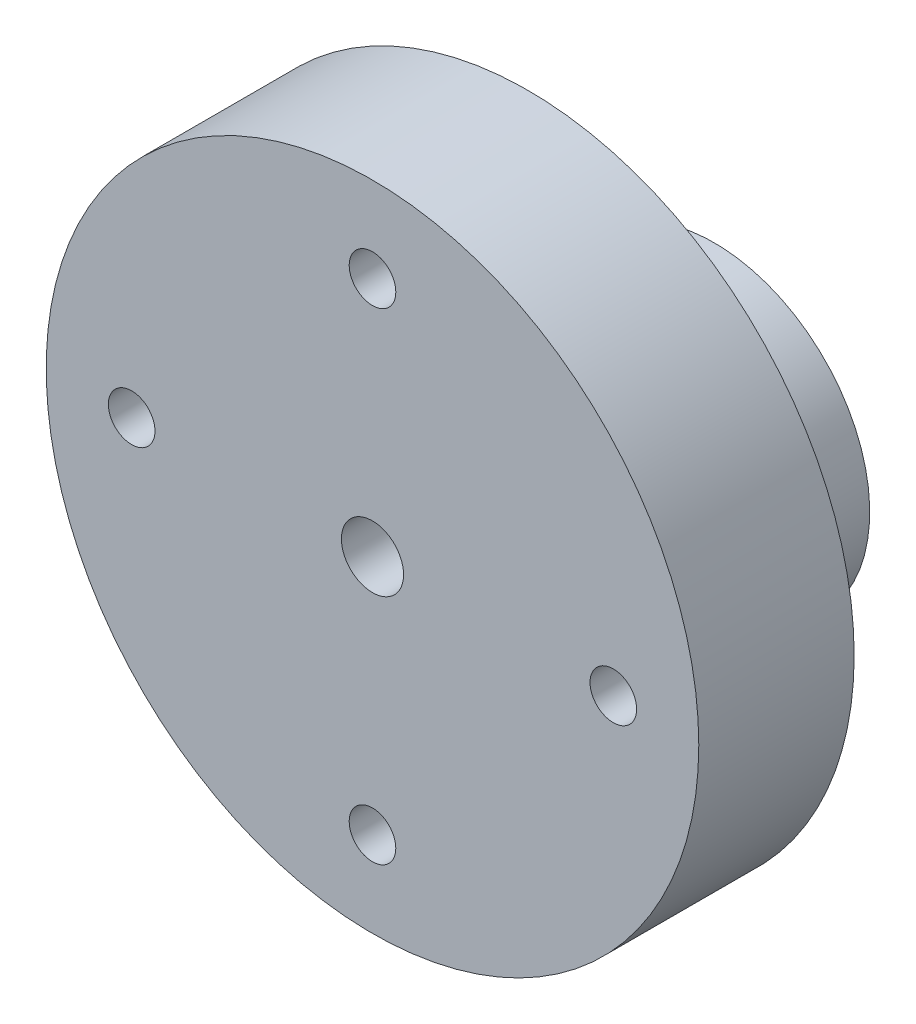
ISO-10303-21;
HEADER;
FILE_DESCRIPTION(('STEP AP214'),'2;1');
FILE_NAME('part.step','',(''),(''),'','','');
FILE_SCHEMA(('AUTOMOTIVE_DESIGN { 1 0 10303 214 1 1 1 1 }'));
ENDSEC;
DATA;
#1=APPLICATION_CONTEXT('core data for automotive mechanical design processes');
#2=APPLICATION_PROTOCOL_DEFINITION('international standard','automotive_design',2000,#1);
#3=PRODUCT_CONTEXT('',#1,'mechanical');
#4=PRODUCT('Part','Part','',(#3));
#5=PRODUCT_RELATED_PRODUCT_CATEGORY('part','',(#4));
#6=PRODUCT_DEFINITION_FORMATION('','',#4);
#7=PRODUCT_DEFINITION_CONTEXT('part definition',#1,'design');
#8=PRODUCT_DEFINITION('design','',#6,#7);
#9=PRODUCT_DEFINITION_SHAPE('','',#8);
#10=(LENGTH_UNIT() NAMED_UNIT(*) SI_UNIT(.MILLI.,.METRE.));
#11=(NAMED_UNIT(*) PLANE_ANGLE_UNIT() SI_UNIT($,.RADIAN.));
#12=(NAMED_UNIT(*) SI_UNIT($,.STERADIAN.) SOLID_ANGLE_UNIT());
#13=UNCERTAINTY_MEASURE_WITH_UNIT(LENGTH_MEASURE(1.E-05),#10,'distance_accuracy_value','');
#14=(GEOMETRIC_REPRESENTATION_CONTEXT(3) GLOBAL_UNCERTAINTY_ASSIGNED_CONTEXT((#13)) GLOBAL_UNIT_ASSIGNED_CONTEXT((#10,
#11,#12)) REPRESENTATION_CONTEXT('',''));
#15=CARTESIAN_POINT('',(0.,0.,0.));
#16=DIRECTION('',(0.,0.,1.));
#17=DIRECTION('',(1.,0.,0.));
#18=AXIS2_PLACEMENT_3D('',#15,#16,#17);
#19=CARTESIAN_POINT('',(0.,15.5,10.));
#20=DIRECTION('',(0.,0.,-1.));
#21=DIRECTION('',(-1.,0.,0.));
#22=AXIS2_PLACEMENT_3D('',#19,#20,#21);
#23=CYLINDRICAL_SURFACE('',#22,1.5);
#24=CARTESIAN_POINT('',(0.,15.5,10.));
#25=DIRECTION('',(0.,0.,1.));
#26=DIRECTION('',(1.,0.,0.));
#27=AXIS2_PLACEMENT_3D('',#24,#25,#26);
#28=CIRCLE('',#27,1.5);
#29=CARTESIAN_POINT('',(1.5,15.5,10.));
#30=VERTEX_POINT('',#29);
#31=EDGE_CURVE('E190',#30,#30,#28,.T.);
#32=ORIENTED_EDGE('',*,*,#31,.T.);
#33=EDGE_LOOP('',(#32));
#34=FACE_BOUND('',#33,.T.);
#35=CARTESIAN_POINT('',(0.,15.5,5.5));
#36=DIRECTION('',(0.,0.,-1.));
#37=DIRECTION('',(-1.,0.,0.));
#38=AXIS2_PLACEMENT_3D('',#35,#36,#37);
#39=CIRCLE('',#38,1.5);
#40=CARTESIAN_POINT('',(-1.5,15.5,5.5));
#41=VERTEX_POINT('',#40);
#42=EDGE_CURVE('E220',#41,#41,#39,.T.);
#43=ORIENTED_EDGE('',*,*,#42,.T.);
#44=EDGE_LOOP('',(#43));
#45=FACE_BOUND('',#44,.T.);
#46=ADVANCED_FACE('F63',(#34,#45),#23,.F.);
#47=CARTESIAN_POINT('',(-15.5,0.,10.));
#48=DIRECTION('',(0.,0.,-1.));
#49=DIRECTION('',(-1.,0.,0.));
#50=AXIS2_PLACEMENT_3D('',#47,#48,#49);
#51=CYLINDRICAL_SURFACE('',#50,1.5);
#52=CARTESIAN_POINT('',(-15.5,0.,10.));
#53=DIRECTION('',(0.,0.,1.));
#54=DIRECTION('',(1.,0.,0.));
#55=AXIS2_PLACEMENT_3D('',#52,#53,#54);
#56=CIRCLE('',#55,1.5);
#57=CARTESIAN_POINT('',(-14.,0.,10.));
#58=VERTEX_POINT('',#57);
#59=EDGE_CURVE('E186',#58,#58,#56,.T.);
#60=ORIENTED_EDGE('',*,*,#59,.T.);
#61=EDGE_LOOP('',(#60));
#62=FACE_BOUND('',#61,.T.);
#63=CARTESIAN_POINT('',(-15.5,0.,5.5));
#64=DIRECTION('',(0.,0.,-1.));
#65=DIRECTION('',(-1.,0.,0.));
#66=AXIS2_PLACEMENT_3D('',#63,#64,#65);
#67=CIRCLE('',#66,1.5);
#68=CARTESIAN_POINT('',(-17.,0.,5.5));
#69=VERTEX_POINT('',#68);
#70=EDGE_CURVE('E217',#69,#69,#67,.T.);
#71=ORIENTED_EDGE('',*,*,#70,.T.);
#72=EDGE_LOOP('',(#71));
#73=FACE_BOUND('',#72,.T.);
#74=ADVANCED_FACE('F307',(#62,#73),#51,.F.);
#75=CARTESIAN_POINT('',(15.5,0.,10.));
#76=DIRECTION('',(0.,0.,-1.));
#77=DIRECTION('',(-1.,0.,0.));
#78=AXIS2_PLACEMENT_3D('',#75,#76,#77);
#79=CYLINDRICAL_SURFACE('',#78,1.5);
#80=CARTESIAN_POINT('',(15.5,0.,10.));
#81=DIRECTION('',(0.,0.,1.));
#82=DIRECTION('',(1.,0.,0.));
#83=AXIS2_PLACEMENT_3D('',#80,#81,#82);
#84=CIRCLE('',#83,1.5);
#85=CARTESIAN_POINT('',(17.,0.,10.));
#86=VERTEX_POINT('',#85);
#87=EDGE_CURVE('E182',#86,#86,#84,.T.);
#88=ORIENTED_EDGE('',*,*,#87,.T.);
#89=EDGE_LOOP('',(#88));
#90=FACE_BOUND('',#89,.T.);
#91=CARTESIAN_POINT('',(15.5,0.,5.5));
#92=DIRECTION('',(0.,0.,-1.));
#93=DIRECTION('',(-1.,0.,0.));
#94=AXIS2_PLACEMENT_3D('',#91,#92,#93);
#95=CIRCLE('',#94,1.5);
#96=CARTESIAN_POINT('',(14.,0.,5.5));
#97=VERTEX_POINT('',#96);
#98=EDGE_CURVE('E213',#97,#97,#95,.T.);
#99=ORIENTED_EDGE('',*,*,#98,.T.);
#100=EDGE_LOOP('',(#99));
#101=FACE_BOUND('',#100,.T.);
#102=ADVANCED_FACE('F313',(#90,#101),#79,.F.);
#103=CARTESIAN_POINT('',(0.,-15.5,10.));
#104=DIRECTION('',(0.,0.,-1.));
#105=DIRECTION('',(-1.,0.,0.));
#106=AXIS2_PLACEMENT_3D('',#103,#104,#105);
#107=CYLINDRICAL_SURFACE('',#106,1.5);
#108=CARTESIAN_POINT('',(0.,-15.5,10.));
#109=DIRECTION('',(0.,0.,1.));
#110=DIRECTION('',(1.,0.,0.));
#111=AXIS2_PLACEMENT_3D('',#108,#109,#110);
#112=CIRCLE('',#111,1.5);
#113=CARTESIAN_POINT('',(1.5,-15.5,10.));
#114=VERTEX_POINT('',#113);
#115=EDGE_CURVE('E173',#114,#114,#112,.T.);
#116=ORIENTED_EDGE('',*,*,#115,.T.);
#117=EDGE_LOOP('',(#116));
#118=FACE_BOUND('',#117,.T.);
#119=CARTESIAN_POINT('',(0.,-15.5,5.5));
#120=DIRECTION('',(0.,0.,-1.));
#121=DIRECTION('',(-1.,0.,0.));
#122=AXIS2_PLACEMENT_3D('',#119,#120,#121);
#123=CIRCLE('',#122,1.5);
#124=CARTESIAN_POINT('',(-1.5,-15.5,5.5));
#125=VERTEX_POINT('',#124);
#126=EDGE_CURVE('E209',#125,#125,#123,.T.);
#127=ORIENTED_EDGE('',*,*,#126,.T.);
#128=EDGE_LOOP('',(#127));
#129=FACE_BOUND('',#128,.T.);
#130=ADVANCED_FACE('F409',(#118,#129),#107,.F.);
#131=CARTESIAN_POINT('',(0.,-3.5,-3.5));
#132=DIRECTION('',(0.,0.,1.));
#133=DIRECTION('',(1.,0.,0.));
#134=AXIS2_PLACEMENT_3D('',#131,#132,#133);
#135=CYLINDRICAL_SURFACE('',#134,14.);
#136=DIRECTION('',(0.,0.,1.));
#137=VECTOR('',#136,1.);
#138=CARTESIAN_POINT('',(-13.9984625341712,-3.7074769370439,-5.));
#139=LINE('',#138,#137);
#140=CARTESIAN_POINT('',(-13.9984625341712,-3.7074769370439,-3.5));
#141=VERTEX_POINT('',#140);
#142=CARTESIAN_POINT('',(-13.9984625341712,-3.7074769370439,0.));
#143=VERTEX_POINT('',#142);
#144=EDGE_CURVE('E12',#141,#143,#139,.T.);
#145=ORIENTED_EDGE('',*,*,#144,.F.);
#146=CARTESIAN_POINT('',(0.,-3.5,-3.5));
#147=DIRECTION('',(0.,0.,-1.));
#148=DIRECTION('',(-1.,0.,0.));
#149=AXIS2_PLACEMENT_3D('',#146,#147,#148);
#150=CIRCLE('',#149,14.);
#151=CARTESIAN_POINT('',(-3.70809924354783,-17.,-3.5));
#152=VERTEX_POINT('',#151);
#153=EDGE_CURVE('E153',#152,#141,#150,.T.);
#154=ORIENTED_EDGE('',*,*,#153,.F.);
#155=DIRECTION('',(0.,0.,1.));
#156=VECTOR('',#155,1.);
#157=CARTESIAN_POINT('',(-3.70809924354783,-17.,-5.));
#158=LINE('',#157,#156);
#159=CARTESIAN_POINT('',(-3.70809924354784,-17.,0.));
#160=VERTEX_POINT('',#159);
#161=EDGE_CURVE('E265',#160,#152,#158,.F.);
#162=ORIENTED_EDGE('',*,*,#161,.F.);
#163=CARTESIAN_POINT('',(0.,-3.5,0.));
#164=DIRECTION('',(0.,0.,-1.));
#165=DIRECTION('',(-1.,0.,0.));
#166=AXIS2_PLACEMENT_3D('',#163,#164,#165);
#167=CIRCLE('',#166,14.);
#168=EDGE_CURVE('E178',#160,#143,#167,.T.);
#169=ORIENTED_EDGE('',*,*,#168,.T.);
#170=EDGE_LOOP('',(#145,#154,#162,#169));
#171=FACE_BOUND('',#170,.T.);
#172=ADVANCED_FACE('F340',(#171),#135,.T.);
#173=DIRECTION('',(0.,0.,1.));
#174=VECTOR('',#173,1.);
#175=CARTESIAN_POINT('',(-12.5510424163238,2.7025264419944,-5.));
#176=LINE('',#175,#174);
#177=CARTESIAN_POINT('',(-12.5510424163238,2.7025264419944,0.));
#178=VERTEX_POINT('',#177);
#179=CARTESIAN_POINT('',(-12.5510424163238,2.7025264419944,-3.5));
#180=VERTEX_POINT('',#179);
#181=EDGE_CURVE('E73',#178,#180,#176,.F.);
#182=ORIENTED_EDGE('',*,*,#181,.F.);
#183=CARTESIAN_POINT('',(12.5510424163238,2.7025264419944,0.));
#184=VERTEX_POINT('',#183);
#185=EDGE_CURVE('E169',#178,#184,#167,.T.);
#186=ORIENTED_EDGE('',*,*,#185,.T.);
#187=DIRECTION('',(0.,0.,1.));
#188=VECTOR('',#187,1.);
#189=CARTESIAN_POINT('',(12.5510424163238,2.7025264419944,-5.));
#190=LINE('',#189,#188);
#191=CARTESIAN_POINT('',(12.5510424163238,2.7025264419944,-3.5));
#192=VERTEX_POINT('',#191);
#193=EDGE_CURVE('E204',#192,#184,#190,.T.);
#194=ORIENTED_EDGE('',*,*,#193,.F.);
#195=EDGE_CURVE('E161',#180,#192,#150,.T.);
#196=ORIENTED_EDGE('',*,*,#195,.F.);
#197=EDGE_LOOP('',(#182,#186,#194,#196));
#198=FACE_BOUND('',#197,.T.);
#199=ADVANCED_FACE('F358',(#198),#135,.T.);
#200=DIRECTION('',(0.,0.,1.));
#201=VECTOR('',#200,1.);
#202=CARTESIAN_POINT('',(3.70809924354783,-17.,-5.));
#203=LINE('',#202,#201);
#204=CARTESIAN_POINT('',(3.70809924354783,-17.,-3.5));
#205=VERTEX_POINT('',#204);
#206=CARTESIAN_POINT('',(3.70809924354783,-17.,0.));
#207=VERTEX_POINT('',#206);
#208=EDGE_CURVE('E262',#205,#207,#203,.T.);
#209=ORIENTED_EDGE('',*,*,#208,.F.);
#210=CARTESIAN_POINT('',(13.9984625341712,-3.7074769370439,-3.5));
#211=VERTEX_POINT('',#210);
#212=EDGE_CURVE('E159',#211,#205,#150,.T.);
#213=ORIENTED_EDGE('',*,*,#212,.F.);
#214=DIRECTION('',(0.,0.,1.));
#215=VECTOR('',#214,1.);
#216=CARTESIAN_POINT('',(13.9984625341712,-3.7074769370439,-5.));
#217=LINE('',#216,#215);
#218=CARTESIAN_POINT('',(13.9984625341712,-3.7074769370439,0.));
#219=VERTEX_POINT('',#218);
#220=EDGE_CURVE('E140',#219,#211,#217,.F.);
#221=ORIENTED_EDGE('',*,*,#220,.F.);
#222=EDGE_CURVE('E177',#219,#207,#167,.T.);
#223=ORIENTED_EDGE('',*,*,#222,.T.);
#224=EDGE_LOOP('',(#209,#213,#221,#223));
#225=FACE_BOUND('',#224,.T.);
#226=ADVANCED_FACE('F348',(#225),#135,.T.);
#227=CARTESIAN_POINT('',(0.,-3.5,-12.));
#228=DIRECTION('',(0.,0.,1.));
#229=DIRECTION('',(1.,0.,0.));
#230=AXIS2_PLACEMENT_3D('',#227,#228,#229);
#231=CYLINDRICAL_SURFACE('',#230,10.);
#232=DIRECTION('',(0.,0.,1.));
#233=VECTOR('',#232,1.);
#234=CARTESIAN_POINT('',(3.1224989991992,-13.,-5.));
#235=LINE('',#234,#233);
#236=CARTESIAN_POINT('',(3.1224989991992,-13.,-12.));
#237=VERTEX_POINT('',#236);
#238=CARTESIAN_POINT('',(3.1224989991992,-13.,-3.5));
#239=VERTEX_POINT('',#238);
#240=EDGE_CURVE('E132',#237,#239,#235,.T.);
#241=ORIENTED_EDGE('',*,*,#240,.F.);
#242=CARTESIAN_POINT('',(0.,-3.5,-12.));
#243=DIRECTION('',(0.,0.,-1.));
#244=DIRECTION('',(-1.,0.,0.));
#245=AXIS2_PLACEMENT_3D('',#242,#243,#244);
#246=CIRCLE('',#245,10.);
#247=CARTESIAN_POINT('',(-3.1224989991992,-13.,-12.));
#248=VERTEX_POINT('',#247);
#249=EDGE_CURVE('E146',#248,#237,#246,.T.);
#250=ORIENTED_EDGE('',*,*,#249,.F.);
#251=DIRECTION('',(0.,0.,1.));
#252=VECTOR('',#251,1.);
#253=CARTESIAN_POINT('',(-3.1224989991992,-13.,-5.));
#254=LINE('',#253,#252);
#255=CARTESIAN_POINT('',(-3.1224989991992,-13.,-3.5));
#256=VERTEX_POINT('',#255);
#257=EDGE_CURVE('E135',#256,#248,#254,.F.);
#258=ORIENTED_EDGE('',*,*,#257,.F.);
#259=CARTESIAN_POINT('',(0.,-3.5,-3.5));
#260=DIRECTION('',(0.,0.,-1.));
#261=DIRECTION('',(-1.,0.,0.));
#262=AXIS2_PLACEMENT_3D('',#259,#260,#261);
#263=CIRCLE('',#262,10.);
#264=EDGE_CURVE('E141',#256,#239,#263,.T.);
#265=ORIENTED_EDGE('',*,*,#264,.T.);
#266=EDGE_LOOP('',(#241,#250,#258,#265));
#267=FACE_BOUND('',#266,.T.);
#268=ADVANCED_FACE('F145',(#267),#231,.T.);
#269=CARTESIAN_POINT('',(0.,0.,10.));
#270=DIRECTION('',(0.,0.,1.));
#271=DIRECTION('',(1.,0.,0.));
#272=AXIS2_PLACEMENT_3D('',#269,#270,#271);
#273=PLANE('',#272);
#274=CARTESIAN_POINT('',(0.,0.,10.));
#275=DIRECTION('',(0.,0.,1.));
#276=DIRECTION('',(1.,0.,0.));
#277=AXIS2_PLACEMENT_3D('',#274,#275,#276);
#278=CIRCLE('',#277,2.);
#279=CARTESIAN_POINT('',(2.,0.,10.));
#280=VERTEX_POINT('',#279);
#281=EDGE_CURVE('E163',#280,#280,#278,.T.);
#282=ORIENTED_EDGE('',*,*,#281,.F.);
#283=EDGE_LOOP('',(#282));
#284=FACE_BOUND('',#283,.T.);
#285=ORIENTED_EDGE('',*,*,#87,.F.);
#286=EDGE_LOOP('',(#285));
#287=FACE_BOUND('',#286,.T.);
#288=ORIENTED_EDGE('',*,*,#31,.F.);
#289=EDGE_LOOP('',(#288));
#290=FACE_BOUND('',#289,.T.);
#291=CARTESIAN_POINT('',(0.,0.,10.));
#292=DIRECTION('',(0.,0.,1.));
#293=DIRECTION('',(1.,0.,0.));
#294=AXIS2_PLACEMENT_3D('',#291,#292,#293);
#295=CIRCLE('',#294,21.);
#296=CARTESIAN_POINT('',(21.,0.,10.));
#297=VERTEX_POINT('',#296);
#298=EDGE_CURVE('E195',#297,#297,#295,.T.);
#299=ORIENTED_EDGE('',*,*,#298,.T.);
#300=EDGE_LOOP('',(#299));
#301=FACE_BOUND('',#300,.T.);
#302=ORIENTED_EDGE('',*,*,#59,.F.);
#303=EDGE_LOOP('',(#302));
#304=FACE_BOUND('',#303,.T.);
#305=ORIENTED_EDGE('',*,*,#115,.F.);
#306=EDGE_LOOP('',(#305));
#307=FACE_BOUND('',#306,.T.);
#308=ADVANCED_FACE('F318',(#284,#287,#290,#301,#304,#307),#273,.T.);
#309=CARTESIAN_POINT('',(0.,0.,0.));
#310=DIRECTION('',(0.,0.,1.));
#311=DIRECTION('',(1.,0.,0.));
#312=AXIS2_PLACEMENT_3D('',#309,#310,#311);
#313=PLANE('',#312);
#314=CARTESIAN_POINT('',(0.,15.5,0.));
#315=DIRECTION('',(0.,0.,1.));
#316=DIRECTION('',(1.,0.,0.));
#317=AXIS2_PLACEMENT_3D('',#314,#315,#316);
#318=CIRCLE('',#317,4.);
#319=CARTESIAN_POINT('',(4.,15.5,0.));
#320=VERTEX_POINT('',#319);
#321=EDGE_CURVE('E67',#320,#320,#318,.F.);
#322=ORIENTED_EDGE('',*,*,#321,.F.);
#323=EDGE_LOOP('',(#322));
#324=FACE_BOUND('',#323,.T.);
#325=CARTESIAN_POINT('',(-15.5,0.,0.));
#326=DIRECTION('',(0.,0.,1.));
#327=DIRECTION('',(1.,0.,0.));
#328=AXIS2_PLACEMENT_3D('',#325,#326,#327);
#329=CIRCLE('',#328,4.);
#330=EDGE_CURVE('E88',#143,#178,#329,.F.);
#331=ORIENTED_EDGE('',*,*,#330,.F.);
#332=ORIENTED_EDGE('',*,*,#168,.F.);
#333=CARTESIAN_POINT('',(0.,-15.5,0.));
#334=DIRECTION('',(0.,0.,1.));
#335=DIRECTION('',(1.,0.,0.));
#336=AXIS2_PLACEMENT_3D('',#333,#334,#335);
#337=CIRCLE('',#336,4.);
#338=EDGE_CURVE('E259',#207,#160,#337,.F.);
#339=ORIENTED_EDGE('',*,*,#338,.F.);
#340=ORIENTED_EDGE('',*,*,#222,.F.);
#341=CARTESIAN_POINT('',(15.5,0.,0.));
#342=DIRECTION('',(0.,0.,1.));
#343=DIRECTION('',(1.,0.,0.));
#344=AXIS2_PLACEMENT_3D('',#341,#342,#343);
#345=CIRCLE('',#344,4.);
#346=EDGE_CURVE('E81',#184,#219,#345,.F.);
#347=ORIENTED_EDGE('',*,*,#346,.F.);
#348=ORIENTED_EDGE('',*,*,#185,.F.);
#349=EDGE_LOOP('',(#331,#332,#339,#340,#347,#348));
#350=FACE_BOUND('',#349,.T.);
#351=CARTESIAN_POINT('',(0.,0.,0.));
#352=DIRECTION('',(0.,0.,1.));
#353=DIRECTION('',(1.,0.,0.));
#354=AXIS2_PLACEMENT_3D('',#351,#352,#353);
#355=CIRCLE('',#354,21.);
#356=CARTESIAN_POINT('',(21.,0.,0.));
#357=VERTEX_POINT('',#356);
#358=EDGE_CURVE('E194',#357,#357,#355,.T.);
#359=ORIENTED_EDGE('',*,*,#358,.F.);
#360=EDGE_LOOP('',(#359));
#361=FACE_BOUND('',#360,.T.);
#362=ADVANCED_FACE('F320',(#324,#350,#361),#313,.F.);
#363=CARTESIAN_POINT('',(0.,0.,10.));
#364=DIRECTION('',(0.,0.,-1.));
#365=DIRECTION('',(-1.,0.,0.));
#366=AXIS2_PLACEMENT_3D('',#363,#364,#365);
#367=CYLINDRICAL_SURFACE('',#366,21.);
#368=ORIENTED_EDGE('',*,*,#298,.F.);
#369=EDGE_LOOP('',(#368));
#370=FACE_BOUND('',#369,.T.);
#371=ORIENTED_EDGE('',*,*,#358,.T.);
#372=EDGE_LOOP('',(#371));
#373=FACE_BOUND('',#372,.T.);
#374=ADVANCED_FACE('F65',(#370,#373),#367,.T.);
#375=CARTESIAN_POINT('',(0.,-3.5,-3.5));
#376=DIRECTION('',(0.,0.,-1.));
#377=DIRECTION('',(-1.,0.,0.));
#378=AXIS2_PLACEMENT_3D('',#375,#376,#377);
#379=PLANE('',#378);
#380=ORIENTED_EDGE('',*,*,#153,.T.);
#381=CARTESIAN_POINT('',(-15.5,0.,-3.5));
#382=DIRECTION('',(0.,0.,-1.));
#383=DIRECTION('',(-1.,0.,0.));
#384=AXIS2_PLACEMENT_3D('',#381,#382,#383);
#385=CIRCLE('',#384,4.);
#386=EDGE_CURVE('E249',#141,#180,#385,.F.);
#387=ORIENTED_EDGE('',*,*,#386,.T.);
#388=ORIENTED_EDGE('',*,*,#195,.T.);
#389=CARTESIAN_POINT('',(15.5,0.,-3.5));
#390=DIRECTION('',(0.,0.,-1.));
#391=DIRECTION('',(-1.,0.,0.));
#392=AXIS2_PLACEMENT_3D('',#389,#390,#391);
#393=CIRCLE('',#392,4.);
#394=EDGE_CURVE('E255',#192,#211,#393,.F.);
#395=ORIENTED_EDGE('',*,*,#394,.T.);
#396=ORIENTED_EDGE('',*,*,#212,.T.);
#397=CARTESIAN_POINT('',(0.,-15.5,-3.5));
#398=DIRECTION('',(0.,0.,-1.));
#399=DIRECTION('',(-1.,0.,0.));
#400=AXIS2_PLACEMENT_3D('',#397,#398,#399);
#401=CIRCLE('',#400,4.);
#402=EDGE_CURVE('E268',#205,#239,#401,.F.);
#403=ORIENTED_EDGE('',*,*,#402,.T.);
#404=ORIENTED_EDGE('',*,*,#264,.F.);
#405=EDGE_CURVE('E149',#256,#152,#401,.F.);
#406=ORIENTED_EDGE('',*,*,#405,.T.);
#407=EDGE_LOOP('',(#380,#387,#388,#395,#396,#403,#404,#406));
#408=FACE_BOUND('',#407,.T.);
#409=ADVANCED_FACE('F327',(#408),#379,.T.);
#410=CARTESIAN_POINT('',(0.,-3.5,-12.));
#411=DIRECTION('',(0.,0.,-1.));
#412=DIRECTION('',(-1.,0.,0.));
#413=AXIS2_PLACEMENT_3D('',#410,#411,#412);
#414=PLANE('',#413);
#415=CARTESIAN_POINT('',(6.5,0.,-12.));
#416=DIRECTION('',(0.,0.,-1.));
#417=DIRECTION('',(-1.,0.,0.));
#418=AXIS2_PLACEMENT_3D('',#415,#416,#417);
#419=CIRCLE('',#418,1.4);
#420=CARTESIAN_POINT('',(5.1,0.,-12.));
#421=VERTEX_POINT('',#420);
#422=EDGE_CURVE('E237',#421,#421,#419,.T.);
#423=ORIENTED_EDGE('',*,*,#422,.F.);
#424=EDGE_LOOP('',(#423));
#425=FACE_BOUND('',#424,.T.);
#426=CARTESIAN_POINT('',(-6.5,0.,-12.));
#427=DIRECTION('',(0.,0.,-1.));
#428=DIRECTION('',(1.,0.,0.));
#429=AXIS2_PLACEMENT_3D('',#426,#427,#428);
#430=CIRCLE('',#429,1.4);
#431=CARTESIAN_POINT('',(-5.1,0.,-12.));
#432=VERTEX_POINT('',#431);
#433=EDGE_CURVE('E227',#432,#432,#430,.T.);
#434=ORIENTED_EDGE('',*,*,#433,.F.);
#435=EDGE_LOOP('',(#434));
#436=FACE_BOUND('',#435,.T.);
#437=CARTESIAN_POINT('',(0.,0.,-12.));
#438=DIRECTION('',(0.,0.,-1.));
#439=DIRECTION('',(-1.,0.,0.));
#440=AXIS2_PLACEMENT_3D('',#437,#438,#439);
#441=CIRCLE('',#440,2.);
#442=CARTESIAN_POINT('',(-2.,0.,-12.));
#443=VERTEX_POINT('',#442);
#444=EDGE_CURVE('E154',#443,#443,#441,.T.);
#445=ORIENTED_EDGE('',*,*,#444,.F.);
#446=EDGE_LOOP('',(#445));
#447=FACE_BOUND('',#446,.T.);
#448=ORIENTED_EDGE('',*,*,#249,.T.);
#449=CARTESIAN_POINT('',(0.,-15.5,-12.));
#450=DIRECTION('',(0.,0.,-1.));
#451=DIRECTION('',(-1.,0.,0.));
#452=AXIS2_PLACEMENT_3D('',#449,#450,#451);
#453=CIRCLE('',#452,4.);
#454=EDGE_CURVE('E129',#237,#248,#453,.F.);
#455=ORIENTED_EDGE('',*,*,#454,.T.);
#456=EDGE_LOOP('',(#448,#455));
#457=FACE_BOUND('',#456,.T.);
#458=ADVANCED_FACE('F151',(#425,#436,#447,#457),#414,.T.);
#459=CARTESIAN_POINT('',(0.,0.,-18.));
#460=DIRECTION('',(0.,0.,1.));
#461=DIRECTION('',(1.,0.,0.));
#462=AXIS2_PLACEMENT_3D('',#459,#460,#461);
#463=CYLINDRICAL_SURFACE('',#462,2.);
#464=ORIENTED_EDGE('',*,*,#444,.T.);
#465=EDGE_LOOP('',(#464));
#466=FACE_BOUND('',#465,.T.);
#467=ORIENTED_EDGE('',*,*,#281,.T.);
#468=EDGE_LOOP('',(#467));
#469=FACE_BOUND('',#468,.T.);
#470=ADVANCED_FACE('F395',(#466,#469),#463,.F.);
#471=CARTESIAN_POINT('',(-6.5,0.,-2.5));
#472=DIRECTION('',(0.,0.,-1.));
#473=DIRECTION('',(-1.,0.,0.));
#474=AXIS2_PLACEMENT_3D('',#471,#472,#473);
#475=CYLINDRICAL_SURFACE('',#474,1.4);
#476=CARTESIAN_POINT('',(-6.5,0.,-2.5));
#477=DIRECTION('',(0.,0.,-1.));
#478=DIRECTION('',(1.,0.,0.));
#479=AXIS2_PLACEMENT_3D('',#476,#477,#478);
#480=CIRCLE('',#479,1.4);
#481=CARTESIAN_POINT('',(-5.1,0.,-2.5));
#482=VERTEX_POINT('',#481);
#483=EDGE_CURVE('E232',#482,#482,#480,.T.);
#484=ORIENTED_EDGE('',*,*,#483,.F.);
#485=EDGE_LOOP('',(#484));
#486=FACE_BOUND('',#485,.T.);
#487=ORIENTED_EDGE('',*,*,#433,.T.);
#488=EDGE_LOOP('',(#487));
#489=FACE_BOUND('',#488,.T.);
#490=ADVANCED_FACE('F391',(#486,#489),#475,.F.);
#491=CARTESIAN_POINT('',(-6.5,0.,-2.5));
#492=DIRECTION('',(0.,0.,1.));
#493=DIRECTION('',(1.,0.,0.));
#494=AXIS2_PLACEMENT_3D('',#491,#492,#493);
#495=PLANE('',#494);
#496=ORIENTED_EDGE('',*,*,#483,.T.);
#497=EDGE_LOOP('',(#496));
#498=FACE_BOUND('',#497,.T.);
#499=ADVANCED_FACE('F387',(#498),#495,.F.);
#500=CARTESIAN_POINT('',(6.5,0.,-2.5));
#501=DIRECTION('',(0.,0.,-1.));
#502=DIRECTION('',(-1.,0.,0.));
#503=AXIS2_PLACEMENT_3D('',#500,#501,#502);
#504=CYLINDRICAL_SURFACE('',#503,1.4);
#505=CARTESIAN_POINT('',(6.5,0.,-2.5));
#506=DIRECTION('',(0.,0.,-1.));
#507=DIRECTION('',(-1.,0.,0.));
#508=AXIS2_PLACEMENT_3D('',#505,#506,#507);
#509=CIRCLE('',#508,1.4);
#510=CARTESIAN_POINT('',(5.1,0.,-2.5));
#511=VERTEX_POINT('',#510);
#512=EDGE_CURVE('E243',#511,#511,#509,.T.);
#513=ORIENTED_EDGE('',*,*,#512,.F.);
#514=EDGE_LOOP('',(#513));
#515=FACE_BOUND('',#514,.T.);
#516=ORIENTED_EDGE('',*,*,#422,.T.);
#517=EDGE_LOOP('',(#516));
#518=FACE_BOUND('',#517,.T.);
#519=ADVANCED_FACE('F383',(#515,#518),#504,.F.);
#520=CARTESIAN_POINT('',(6.5,0.,-2.5));
#521=DIRECTION('',(0.,0.,-1.));
#522=DIRECTION('',(-1.,0.,0.));
#523=AXIS2_PLACEMENT_3D('',#520,#521,#522);
#524=PLANE('',#523);
#525=ORIENTED_EDGE('',*,*,#512,.T.);
#526=EDGE_LOOP('',(#525));
#527=FACE_BOUND('',#526,.T.);
#528=ADVANCED_FACE('F375',(#527),#524,.T.);
#529=CARTESIAN_POINT('',(0.,-15.5,-15.5));
#530=DIRECTION('',(0.,0.,1.));
#531=DIRECTION('',(1.,0.,0.));
#532=AXIS2_PLACEMENT_3D('',#529,#530,#531);
#533=CYLINDRICAL_SURFACE('',#532,4.);
#534=CARTESIAN_POINT('',(0.,-15.5,5.5));
#535=DIRECTION('',(0.,0.,-1.));
#536=DIRECTION('',(-1.,0.,0.));
#537=AXIS2_PLACEMENT_3D('',#534,#535,#536);
#538=CIRCLE('',#537,4.);
#539=CARTESIAN_POINT('',(-4.,-15.5,5.5));
#540=VERTEX_POINT('',#539);
#541=EDGE_CURVE('E279',#540,#540,#538,.T.);
#542=ORIENTED_EDGE('',*,*,#541,.F.);
#543=EDGE_LOOP('',(#542));
#544=FACE_BOUND('',#543,.T.);
#545=ORIENTED_EDGE('',*,*,#338,.T.);
#546=ORIENTED_EDGE('',*,*,#161,.T.);
#547=ORIENTED_EDGE('',*,*,#405,.F.);
#548=ORIENTED_EDGE('',*,*,#257,.T.);
#549=ORIENTED_EDGE('',*,*,#454,.F.);
#550=ORIENTED_EDGE('',*,*,#240,.T.);
#551=ORIENTED_EDGE('',*,*,#402,.F.);
#552=ORIENTED_EDGE('',*,*,#208,.T.);
#553=EDGE_LOOP('',(#545,#546,#547,#548,#549,#550,#551,#552));
#554=FACE_BOUND('',#553,.T.);
#555=ADVANCED_FACE('F131',(#544,#554),#533,.F.);
#556=CARTESIAN_POINT('',(0.,-15.5,5.5));
#557=DIRECTION('',(0.,0.,-1.));
#558=DIRECTION('',(-1.,0.,0.));
#559=AXIS2_PLACEMENT_3D('',#556,#557,#558);
#560=PLANE('',#559);
#561=ORIENTED_EDGE('',*,*,#126,.F.);
#562=EDGE_LOOP('',(#561));
#563=FACE_BOUND('',#562,.T.);
#564=ORIENTED_EDGE('',*,*,#541,.T.);
#565=EDGE_LOOP('',(#564));
#566=FACE_BOUND('',#565,.T.);
#567=ADVANCED_FACE('F370',(#563,#566),#560,.T.);
#568=CARTESIAN_POINT('',(15.5,0.,-15.5));
#569=DIRECTION('',(0.,0.,1.));
#570=DIRECTION('',(1.,0.,0.));
#571=AXIS2_PLACEMENT_3D('',#568,#569,#570);
#572=CYLINDRICAL_SURFACE('',#571,4.);
#573=CARTESIAN_POINT('',(15.5,0.,5.5));
#574=DIRECTION('',(0.,0.,-1.));
#575=DIRECTION('',(-1.,0.,0.));
#576=AXIS2_PLACEMENT_3D('',#573,#574,#575);
#577=CIRCLE('',#576,4.);
#578=CARTESIAN_POINT('',(11.5,0.,5.5));
#579=VERTEX_POINT('',#578);
#580=EDGE_CURVE('E275',#579,#579,#577,.T.);
#581=ORIENTED_EDGE('',*,*,#580,.F.);
#582=EDGE_LOOP('',(#581));
#583=FACE_BOUND('',#582,.T.);
#584=ORIENTED_EDGE('',*,*,#193,.T.);
#585=ORIENTED_EDGE('',*,*,#346,.T.);
#586=ORIENTED_EDGE('',*,*,#220,.T.);
#587=ORIENTED_EDGE('',*,*,#394,.F.);
#588=EDGE_LOOP('',(#584,#585,#586,#587));
#589=FACE_BOUND('',#588,.T.);
#590=ADVANCED_FACE('F356',(#583,#589),#572,.F.);
#591=CARTESIAN_POINT('',(15.5,0.,5.5));
#592=DIRECTION('',(0.,0.,-1.));
#593=DIRECTION('',(-1.,0.,0.));
#594=AXIS2_PLACEMENT_3D('',#591,#592,#593);
#595=PLANE('',#594);
#596=ORIENTED_EDGE('',*,*,#98,.F.);
#597=EDGE_LOOP('',(#596));
#598=FACE_BOUND('',#597,.T.);
#599=ORIENTED_EDGE('',*,*,#580,.T.);
#600=EDGE_LOOP('',(#599));
#601=FACE_BOUND('',#600,.T.);
#602=ADVANCED_FACE('F360',(#598,#601),#595,.T.);
#603=CARTESIAN_POINT('',(-15.5,0.,-15.5));
#604=DIRECTION('',(0.,0.,1.));
#605=DIRECTION('',(1.,0.,0.));
#606=AXIS2_PLACEMENT_3D('',#603,#604,#605);
#607=CYLINDRICAL_SURFACE('',#606,4.);
#608=CARTESIAN_POINT('',(-15.5,0.,5.5));
#609=DIRECTION('',(0.,0.,-1.));
#610=DIRECTION('',(-1.,0.,0.));
#611=AXIS2_PLACEMENT_3D('',#608,#609,#610);
#612=CIRCLE('',#611,4.);
#613=CARTESIAN_POINT('',(-19.5,0.,5.5));
#614=VERTEX_POINT('',#613);
#615=EDGE_CURVE('E283',#614,#614,#612,.T.);
#616=ORIENTED_EDGE('',*,*,#615,.F.);
#617=EDGE_LOOP('',(#616));
#618=FACE_BOUND('',#617,.T.);
#619=ORIENTED_EDGE('',*,*,#144,.T.);
#620=ORIENTED_EDGE('',*,*,#330,.T.);
#621=ORIENTED_EDGE('',*,*,#181,.T.);
#622=ORIENTED_EDGE('',*,*,#386,.F.);
#623=EDGE_LOOP('',(#619,#620,#621,#622));
#624=FACE_BOUND('',#623,.T.);
#625=ADVANCED_FACE('F303',(#618,#624),#607,.F.);
#626=CARTESIAN_POINT('',(-15.5,0.,5.5));
#627=DIRECTION('',(0.,0.,-1.));
#628=DIRECTION('',(-1.,0.,0.));
#629=AXIS2_PLACEMENT_3D('',#626,#627,#628);
#630=PLANE('',#629);
#631=ORIENTED_EDGE('',*,*,#70,.F.);
#632=EDGE_LOOP('',(#631));
#633=FACE_BOUND('',#632,.T.);
#634=ORIENTED_EDGE('',*,*,#615,.T.);
#635=EDGE_LOOP('',(#634));
#636=FACE_BOUND('',#635,.T.);
#637=ADVANCED_FACE('F295',(#633,#636),#630,.T.);
#638=CARTESIAN_POINT('',(0.,15.5,-15.5));
#639=DIRECTION('',(0.,0.,1.));
#640=DIRECTION('',(1.,0.,0.));
#641=AXIS2_PLACEMENT_3D('',#638,#639,#640);
#642=CYLINDRICAL_SURFACE('',#641,4.);
#643=CARTESIAN_POINT('',(0.,15.5,5.5));
#644=DIRECTION('',(0.,0.,-1.));
#645=DIRECTION('',(-1.,0.,0.));
#646=AXIS2_PLACEMENT_3D('',#643,#644,#645);
#647=CIRCLE('',#646,4.);
#648=CARTESIAN_POINT('',(-4.,15.5,5.5));
#649=VERTEX_POINT('',#648);
#650=EDGE_CURVE('E274',#649,#649,#647,.T.);
#651=ORIENTED_EDGE('',*,*,#650,.F.);
#652=EDGE_LOOP('',(#651));
#653=FACE_BOUND('',#652,.T.);
#654=ORIENTED_EDGE('',*,*,#321,.T.);
#655=EDGE_LOOP('',(#654));
#656=FACE_BOUND('',#655,.T.);
#657=ADVANCED_FACE('F293',(#653,#656),#642,.F.);
#658=CARTESIAN_POINT('',(0.,15.5,5.5));
#659=DIRECTION('',(0.,0.,-1.));
#660=DIRECTION('',(-1.,0.,0.));
#661=AXIS2_PLACEMENT_3D('',#658,#659,#660);
#662=PLANE('',#661);
#663=ORIENTED_EDGE('',*,*,#42,.F.);
#664=EDGE_LOOP('',(#663));
#665=FACE_BOUND('',#664,.T.);
#666=ORIENTED_EDGE('',*,*,#650,.T.);
#667=EDGE_LOOP('',(#666));
#668=FACE_BOUND('',#667,.T.);
#669=ADVANCED_FACE('F291',(#665,#668),#662,.T.);
#670=CLOSED_SHELL('',(#46,#74,#102,#130,#172,#199,#226,#268,#308,#362,#374,#409,#458,#470,#490,
#499,#519,#528,#555,#567,#590,#602,#625,#637,#657,#669));
#671=MANIFOLD_SOLID_BREP('B2',#670);
#672=ADVANCED_BREP_SHAPE_REPRESENTATION('',(#18,#671),#14);
#673=SHAPE_DEFINITION_REPRESENTATION(#9,#672);
ENDSEC;
END-ISO-10303-21;
